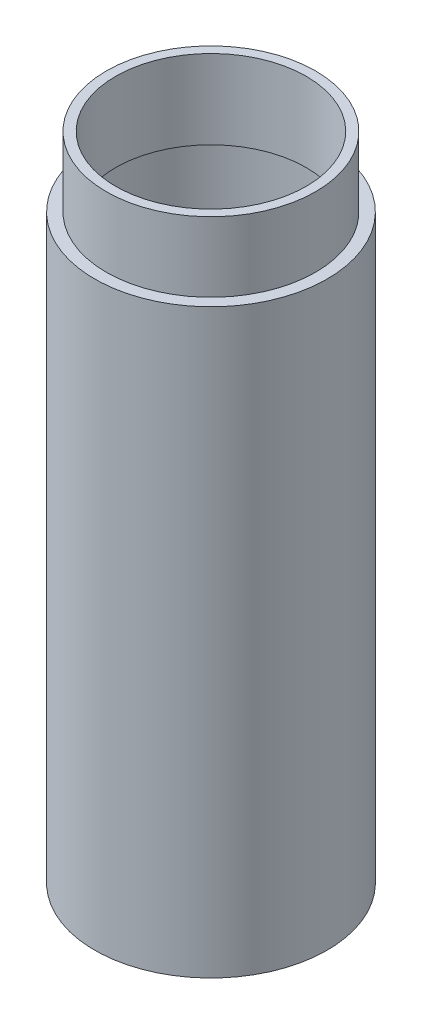
ISO-10303-21;
HEADER;
FILE_DESCRIPTION(('STEP AP214'),'2;1');
FILE_NAME('part.step','',(''),(''),'','','');
FILE_SCHEMA(('AUTOMOTIVE_DESIGN { 1 0 10303 214 1 1 1 1 }'));
ENDSEC;
DATA;
#1=APPLICATION_CONTEXT('core data for automotive mechanical design processes');
#2=APPLICATION_PROTOCOL_DEFINITION('international standard','automotive_design',2000,#1);
#3=PRODUCT_CONTEXT('',#1,'mechanical');
#4=PRODUCT('Part','Part','',(#3));
#5=PRODUCT_RELATED_PRODUCT_CATEGORY('part','',(#4));
#6=PRODUCT_DEFINITION_FORMATION('','',#4);
#7=PRODUCT_DEFINITION_CONTEXT('part definition',#1,'design');
#8=PRODUCT_DEFINITION('design','',#6,#7);
#9=PRODUCT_DEFINITION_SHAPE('','',#8);
#10=(LENGTH_UNIT() NAMED_UNIT(*) SI_UNIT(.MILLI.,.METRE.));
#11=(NAMED_UNIT(*) PLANE_ANGLE_UNIT() SI_UNIT($,.RADIAN.));
#12=(NAMED_UNIT(*) SI_UNIT($,.STERADIAN.) SOLID_ANGLE_UNIT());
#13=UNCERTAINTY_MEASURE_WITH_UNIT(LENGTH_MEASURE(1.E-05),#10,'distance_accuracy_value','');
#14=(GEOMETRIC_REPRESENTATION_CONTEXT(3) GLOBAL_UNCERTAINTY_ASSIGNED_CONTEXT((#13)) GLOBAL_UNIT_ASSIGNED_CONTEXT((#10,
#11,#12)) REPRESENTATION_CONTEXT('',''));
#15=CARTESIAN_POINT('',(0.,0.,0.));
#16=DIRECTION('',(0.,0.,1.));
#17=DIRECTION('',(1.,0.,0.));
#18=AXIS2_PLACEMENT_3D('',#15,#16,#17);
#19=CARTESIAN_POINT('',(0.,158.75,0.));
#20=DIRECTION('',(0.,-1.,0.));
#21=DIRECTION('',(0.,0.,-1.));
#22=AXIS2_PLACEMENT_3D('',#19,#20,#21);
#23=CYLINDRICAL_SURFACE('',#22,31.75);
#24=CARTESIAN_POINT('',(0.,158.75,0.));
#25=DIRECTION('',(0.,1.,0.));
#26=DIRECTION('',(0.,0.,1.));
#27=AXIS2_PLACEMENT_3D('',#24,#25,#26);
#28=CIRCLE('',#27,31.75);
#29=CARTESIAN_POINT('',(0.,158.75,-31.75));
#30=VERTEX_POINT('',#29);
#31=EDGE_CURVE('E46',#30,#30,#28,.T.);
#32=CARTESIAN_POINT('',(0.,0.,0.));
#33=DIRECTION('',(0.,1.,0.));
#34=DIRECTION('',(0.,0.,1.));
#35=AXIS2_PLACEMENT_3D('',#32,#33,#34);
#36=CIRCLE('',#35,31.75);
#37=CARTESIAN_POINT('',(0.,0.,-31.75));
#38=VERTEX_POINT('',#37);
#39=EDGE_CURVE('E82',#38,#38,#36,.T.);
#40=CARTESIAN_POINT('',(0.,158.75,-31.75));
#41=CARTESIAN_POINT('',(0.,157.096354166667,-31.75));
#42=CARTESIAN_POINT('',(0.,155.442708333333,-31.75));
#43=CARTESIAN_POINT('',(0.,152.135416666667,-31.75));
#44=CARTESIAN_POINT('',(0.,150.481770833333,-31.75));
#45=CARTESIAN_POINT('',(0.,147.174479166667,-31.75));
#46=CARTESIAN_POINT('',(0.,145.520833333333,-31.75));
#47=CARTESIAN_POINT('',(0.,142.213541666667,-31.75));
#48=CARTESIAN_POINT('',(0.,140.559895833333,-31.75));
#49=CARTESIAN_POINT('',(0.,137.252604166667,-31.75));
#50=CARTESIAN_POINT('',(0.,135.598958333333,-31.75));
#51=CARTESIAN_POINT('',(0.,132.291666666667,-31.75));
#52=CARTESIAN_POINT('',(0.,130.638020833333,-31.75));
#53=CARTESIAN_POINT('',(0.,127.330729166667,-31.75));
#54=CARTESIAN_POINT('',(0.,125.677083333333,-31.75));
#55=CARTESIAN_POINT('',(0.,122.369791666667,-31.75));
#56=CARTESIAN_POINT('',(0.,120.716145833333,-31.75));
#57=CARTESIAN_POINT('',(0.,117.408854166667,-31.75));
#58=CARTESIAN_POINT('',(0.,115.755208333333,-31.75));
#59=CARTESIAN_POINT('',(0.,112.447916666667,-31.75));
#60=CARTESIAN_POINT('',(0.,110.794270833333,-31.75));
#61=CARTESIAN_POINT('',(0.,107.486979166667,-31.75));
#62=CARTESIAN_POINT('',(0.,105.833333333333,-31.75));
#63=CARTESIAN_POINT('',(0.,102.526041666667,-31.75));
#64=CARTESIAN_POINT('',(0.,100.872395833333,-31.75));
#65=CARTESIAN_POINT('',(0.,97.5651041666667,-31.75));
#66=CARTESIAN_POINT('',(0.,95.9114583333333,-31.75));
#67=CARTESIAN_POINT('',(0.,92.6041666666667,-31.75));
#68=CARTESIAN_POINT('',(0.,90.9505208333333,-31.75));
#69=CARTESIAN_POINT('',(0.,87.6432291666667,-31.75));
#70=CARTESIAN_POINT('',(0.,85.9895833333333,-31.75));
#71=CARTESIAN_POINT('',(0.,82.6822916666667,-31.75));
#72=CARTESIAN_POINT('',(0.,81.0286458333333,-31.75));
#73=CARTESIAN_POINT('',(0.,77.7213541666667,-31.75));
#74=CARTESIAN_POINT('',(0.,76.0677083333333,-31.75));
#75=CARTESIAN_POINT('',(0.,72.7604166666667,-31.75));
#76=CARTESIAN_POINT('',(0.,71.1067708333333,-31.75));
#77=CARTESIAN_POINT('',(0.,67.7994791666666,-31.75));
#78=CARTESIAN_POINT('',(0.,66.1458333333333,-31.75));
#79=CARTESIAN_POINT('',(0.,62.8385416666667,-31.75));
#80=CARTESIAN_POINT('',(0.,61.1848958333333,-31.75));
#81=CARTESIAN_POINT('',(0.,57.8776041666666,-31.75));
#82=CARTESIAN_POINT('',(0.,56.2239583333333,-31.75));
#83=CARTESIAN_POINT('',(0.,52.9166666666667,-31.75));
#84=CARTESIAN_POINT('',(0.,51.2630208333333,-31.75));
#85=CARTESIAN_POINT('',(0.,47.9557291666667,-31.75));
#86=CARTESIAN_POINT('',(0.,46.3020833333333,-31.75));
#87=CARTESIAN_POINT('',(0.,42.9947916666667,-31.75));
#88=CARTESIAN_POINT('',(0.,41.3411458333333,-31.75));
#89=CARTESIAN_POINT('',(0.,38.0338541666667,-31.75));
#90=CARTESIAN_POINT('',(0.,36.3802083333333,-31.75));
#91=CARTESIAN_POINT('',(0.,33.0729166666666,-31.75));
#92=CARTESIAN_POINT('',(0.,31.4192708333333,-31.75));
#93=CARTESIAN_POINT('',(0.,28.1119791666667,-31.75));
#94=CARTESIAN_POINT('',(0.,26.4583333333333,-31.75));
#95=CARTESIAN_POINT('',(0.,23.1510416666666,-31.75));
#96=CARTESIAN_POINT('',(0.,21.4973958333333,-31.75));
#97=CARTESIAN_POINT('',(0.,18.1901041666666,-31.75));
#98=CARTESIAN_POINT('',(0.,16.5364583333333,-31.75));
#99=CARTESIAN_POINT('',(0.,13.2291666666666,-31.75));
#100=CARTESIAN_POINT('',(0.,11.5755208333333,-31.75));
#101=CARTESIAN_POINT('',(0.,8.26822916666664,-31.75));
#102=CARTESIAN_POINT('',(0.,6.61458333333331,-31.75));
#103=CARTESIAN_POINT('',(0.,3.30729166666665,-31.75));
#104=CARTESIAN_POINT('',(0.,1.65364583333331,-31.75));
#105=CARTESIAN_POINT('',(0.,0.,-31.75));
#106=B_SPLINE_CURVE_WITH_KNOTS('',3,(#40,#41,#42,#43,#44,#45,#46,#47,#48,#49,#50,#51,#52,#53,
#54,#55,#56,#57,#58,#59,#60,#61,#62,#63,#64,#65,#66,#67,#68,#69,#70,#71,#72,#73,#74,#75,#76,#77,
#78,#79,#80,#81,#82,#83,#84,#85,#86,#87,#88,#89,#90,#91,#92,#93,#94,#95,#96,#97,#98,#99,#100,
#101,#102,#103,#104,#105),.UNSPECIFIED.,.F.,.F.,(4,2,2,2,2,2,2,2,2,2,2,2,2,2,2,2,2,2,2,2,2,2,2,
2,2,2,2,2,2,2,2,2,4),(0.,4.96093749999998,9.921875,14.8828125,19.84375,24.8046875,29.765625,
34.7265625,39.6875,44.6484375,49.609375,54.5703125,59.53125,64.4921875,69.453125,74.4140625,
79.375,84.3359375,89.296875,94.2578125,99.21875,104.1796875,109.140625,114.1015625,119.0625,
124.0234375,128.984375,133.9453125,138.90625,143.8671875,148.828125,153.7890625,158.75),.UNSPECIFIED.);
#107=EDGE_CURVE('BSEAM37',#30,#38,#106,.T.);
#108=ORIENTED_EDGE('',*,*,#31,.F.);
#109=ORIENTED_EDGE('',*,*,#39,.T.);
#110=ORIENTED_EDGE('',*,*,#107,.T.);
#111=ORIENTED_EDGE('',*,*,#107,.F.);
#112=EDGE_LOOP('',(#108,#110,#109,#111));
#113=FACE_BOUND('',#112,.T.);
#114=ADVANCED_FACE('F37',(#113),#23,.T.);
#115=CARTESIAN_POINT('',(0.,158.75,0.));
#116=DIRECTION('',(0.,1.,0.));
#117=DIRECTION('',(0.,0.,1.));
#118=AXIS2_PLACEMENT_3D('',#115,#116,#117);
#119=PLANE('',#118);
#120=CARTESIAN_POINT('',(0.,158.75,0.));
#121=DIRECTION('',(0.,1.,0.));
#122=DIRECTION('',(0.,0.,1.));
#123=AXIS2_PLACEMENT_3D('',#120,#121,#122);
#124=CIRCLE('',#123,28.575);
#125=CARTESIAN_POINT('',(0.,158.75,-28.575));
#126=VERTEX_POINT('',#125);
#127=EDGE_CURVE('E11',#126,#126,#124,.T.);
#128=ORIENTED_EDGE('',*,*,#127,.F.);
#129=EDGE_LOOP('',(#128));
#130=FACE_BOUND('',#129,.T.);
#131=ORIENTED_EDGE('',*,*,#31,.T.);
#132=EDGE_LOOP('',(#131));
#133=FACE_BOUND('',#132,.T.);
#134=ADVANCED_FACE('F92',(#130,#133),#119,.T.);
#135=CARTESIAN_POINT('',(0.,0.,0.));
#136=DIRECTION('',(0.,1.,0.));
#137=DIRECTION('',(0.,0.,1.));
#138=AXIS2_PLACEMENT_3D('',#135,#136,#137);
#139=PLANE('',#138);
#140=CARTESIAN_POINT('',(0.,0.,0.));
#141=DIRECTION('',(0.,-1.,0.));
#142=DIRECTION('',(0.,0.,-1.));
#143=AXIS2_PLACEMENT_3D('',#140,#141,#142);
#144=CIRCLE('',#143,25.4);
#145=CARTESIAN_POINT('',(0.,0.,-25.4));
#146=VERTEX_POINT('',#145);
#147=EDGE_CURVE('E76',#146,#146,#144,.T.);
#148=ORIENTED_EDGE('',*,*,#147,.F.);
#149=EDGE_LOOP('',(#148));
#150=FACE_BOUND('',#149,.T.);
#151=ORIENTED_EDGE('',*,*,#39,.F.);
#152=EDGE_LOOP('',(#151));
#153=FACE_BOUND('',#152,.T.);
#154=ADVANCED_FACE('F89',(#150,#153),#139,.F.);
#155=CARTESIAN_POINT('',(0.,177.8,0.));
#156=DIRECTION('',(0.,-1.,0.));
#157=DIRECTION('',(0.,0.,-1.));
#158=AXIS2_PLACEMENT_3D('',#155,#156,#157);
#159=CYLINDRICAL_SURFACE('',#158,28.575);
#160=CARTESIAN_POINT('',(0.,177.8,0.));
#161=DIRECTION('',(0.,1.,0.));
#162=DIRECTION('',(0.,0.,1.));
#163=AXIS2_PLACEMENT_3D('',#160,#161,#162);
#164=CIRCLE('',#163,28.575);
#165=CARTESIAN_POINT('',(0.,177.8,-28.575));
#166=VERTEX_POINT('',#165);
#167=EDGE_CURVE('E80',#166,#166,#164,.T.);
#168=CARTESIAN_POINT('',(0.,177.8,-28.575));
#169=CARTESIAN_POINT('',(0.,177.6015625,-28.575));
#170=CARTESIAN_POINT('',(0.,177.403125,-28.575));
#171=CARTESIAN_POINT('',(0.,177.00625,-28.575));
#172=CARTESIAN_POINT('',(0.,176.8078125,-28.575));
#173=CARTESIAN_POINT('',(0.,176.4109375,-28.575));
#174=CARTESIAN_POINT('',(0.,176.2125,-28.575));
#175=CARTESIAN_POINT('',(0.,175.815625,-28.575));
#176=CARTESIAN_POINT('',(0.,175.6171875,-28.575));
#177=CARTESIAN_POINT('',(0.,175.2203125,-28.575));
#178=CARTESIAN_POINT('',(0.,175.021875,-28.575));
#179=CARTESIAN_POINT('',(0.,174.625,-28.575));
#180=CARTESIAN_POINT('',(0.,174.4265625,-28.575));
#181=CARTESIAN_POINT('',(0.,174.0296875,-28.575));
#182=CARTESIAN_POINT('',(0.,173.83125,-28.575));
#183=CARTESIAN_POINT('',(0.,173.434375,-28.575));
#184=CARTESIAN_POINT('',(0.,173.2359375,-28.575));
#185=CARTESIAN_POINT('',(0.,172.8390625,-28.575));
#186=CARTESIAN_POINT('',(0.,172.640625,-28.575));
#187=CARTESIAN_POINT('',(0.,172.24375,-28.575));
#188=CARTESIAN_POINT('',(0.,172.0453125,-28.575));
#189=CARTESIAN_POINT('',(0.,171.6484375,-28.575));
#190=CARTESIAN_POINT('',(0.,171.45,-28.575));
#191=CARTESIAN_POINT('',(0.,171.053125,-28.575));
#192=CARTESIAN_POINT('',(0.,170.8546875,-28.575));
#193=CARTESIAN_POINT('',(0.,170.4578125,-28.575));
#194=CARTESIAN_POINT('',(0.,170.259375,-28.575));
#195=CARTESIAN_POINT('',(0.,169.8625,-28.575));
#196=CARTESIAN_POINT('',(0.,169.6640625,-28.575));
#197=CARTESIAN_POINT('',(0.,169.2671875,-28.575));
#198=CARTESIAN_POINT('',(0.,169.06875,-28.575));
#199=CARTESIAN_POINT('',(0.,168.671875,-28.575));
#200=CARTESIAN_POINT('',(0.,168.4734375,-28.575));
#201=CARTESIAN_POINT('',(0.,168.0765625,-28.575));
#202=CARTESIAN_POINT('',(0.,167.878125,-28.575));
#203=CARTESIAN_POINT('',(0.,167.48125,-28.575));
#204=CARTESIAN_POINT('',(0.,167.2828125,-28.575));
#205=CARTESIAN_POINT('',(0.,166.8859375,-28.575));
#206=CARTESIAN_POINT('',(0.,166.6875,-28.575));
#207=CARTESIAN_POINT('',(0.,166.290625,-28.575));
#208=CARTESIAN_POINT('',(0.,166.0921875,-28.575));
#209=CARTESIAN_POINT('',(0.,165.6953125,-28.575));
#210=CARTESIAN_POINT('',(0.,165.496875,-28.575));
#211=CARTESIAN_POINT('',(0.,165.1,-28.575));
#212=CARTESIAN_POINT('',(0.,164.9015625,-28.575));
#213=CARTESIAN_POINT('',(0.,164.5046875,-28.575));
#214=CARTESIAN_POINT('',(0.,164.30625,-28.575));
#215=CARTESIAN_POINT('',(0.,163.909375,-28.575));
#216=CARTESIAN_POINT('',(0.,163.7109375,-28.575));
#217=CARTESIAN_POINT('',(0.,163.3140625,-28.575));
#218=CARTESIAN_POINT('',(0.,163.115625,-28.575));
#219=CARTESIAN_POINT('',(0.,162.71875,-28.575));
#220=CARTESIAN_POINT('',(0.,162.5203125,-28.575));
#221=CARTESIAN_POINT('',(0.,162.1234375,-28.575));
#222=CARTESIAN_POINT('',(0.,161.925,-28.575));
#223=CARTESIAN_POINT('',(0.,161.528125,-28.575));
#224=CARTESIAN_POINT('',(0.,161.3296875,-28.575));
#225=CARTESIAN_POINT('',(0.,160.9328125,-28.575));
#226=CARTESIAN_POINT('',(0.,160.734375,-28.575));
#227=CARTESIAN_POINT('',(0.,160.3375,-28.575));
#228=CARTESIAN_POINT('',(0.,160.1390625,-28.575));
#229=CARTESIAN_POINT('',(0.,159.7421875,-28.575));
#230=CARTESIAN_POINT('',(0.,159.54375,-28.575));
#231=CARTESIAN_POINT('',(0.,159.146875,-28.575));
#232=CARTESIAN_POINT('',(0.,158.9484375,-28.575));
#233=CARTESIAN_POINT('',(0.,158.75,-28.575));
#234=B_SPLINE_CURVE_WITH_KNOTS('',3,(#168,#169,#170,#171,#172,#173,#174,#175,#176,#177,#178,
#179,#180,#181,#182,#183,#184,#185,#186,#187,#188,#189,#190,#191,#192,#193,#194,#195,#196,#197,
#198,#199,#200,#201,#202,#203,#204,#205,#206,#207,#208,#209,#210,#211,#212,#213,#214,#215,#216,
#217,#218,#219,#220,#221,#222,#223,#224,#225,#226,#227,#228,#229,#230,#231,#232,#233),
.UNSPECIFIED.,.F.,.F.,(4,2,2,2,2,2,2,2,2,2,2,2,2,2,2,2,2,2,2,2,2,2,2,2,2,2,2,2,2,2,2,2,4),(0.,
0.595312500000028,1.19062500000003,1.78593750000003,2.38125000000003,2.97656250000003,
3.57187500000003,4.16718750000003,4.76250000000003,5.35781250000003,5.95312500000003,
6.54843750000003,7.14375000000003,7.73906250000003,8.33437500000003,8.92968750000003,
9.52500000000003,10.1203125,10.715625,11.3109375,11.90625,12.5015625,13.096875,13.6921875,
14.2875,14.8828125,15.478125,16.0734375,16.66875,17.2640625,17.859375,18.4546875,19.05),.UNSPECIFIED.);
#235=EDGE_CURVE('BSEAM91',#166,#126,#234,.T.);
#236=ORIENTED_EDGE('',*,*,#167,.F.);
#237=ORIENTED_EDGE('',*,*,#127,.T.);
#238=ORIENTED_EDGE('',*,*,#235,.T.);
#239=ORIENTED_EDGE('',*,*,#235,.F.);
#240=EDGE_LOOP('',(#236,#238,#237,#239));
#241=FACE_BOUND('',#240,.T.);
#242=ADVANCED_FACE('F91',(#241),#159,.T.);
#243=CARTESIAN_POINT('',(0.,177.8,0.));
#244=DIRECTION('',(0.,1.,0.));
#245=DIRECTION('',(0.,0.,1.));
#246=AXIS2_PLACEMENT_3D('',#243,#244,#245);
#247=PLANE('',#246);
#248=CARTESIAN_POINT('',(0.,177.8,0.));
#249=DIRECTION('',(0.,1.,0.));
#250=DIRECTION('',(0.,0.,1.));
#251=AXIS2_PLACEMENT_3D('',#248,#249,#250);
#252=CIRCLE('',#251,26.035);
#253=CARTESIAN_POINT('',(0.,177.8,-26.035));
#254=VERTEX_POINT('',#253);
#255=EDGE_CURVE('E69',#254,#254,#252,.T.);
#256=ORIENTED_EDGE('',*,*,#255,.F.);
#257=EDGE_LOOP('',(#256));
#258=FACE_BOUND('',#257,.T.);
#259=ORIENTED_EDGE('',*,*,#167,.T.);
#260=EDGE_LOOP('',(#259));
#261=FACE_BOUND('',#260,.T.);
#262=ADVANCED_FACE('F99',(#258,#261),#247,.T.);
#263=CARTESIAN_POINT('',(0.,0.,0.));
#264=DIRECTION('',(0.,-1.,0.));
#265=DIRECTION('',(0.,0.,-1.));
#266=AXIS2_PLACEMENT_3D('',#263,#264,#265);
#267=CONICAL_SURFACE('',#266,25.4,0.78539816339745);
#268=CARTESIAN_POINT('',(0.,6.35,0.));
#269=DIRECTION('',(0.,-1.,0.));
#270=DIRECTION('',(0.,0.,-1.));
#271=AXIS2_PLACEMENT_3D('',#268,#269,#270);
#272=CIRCLE('',#271,19.05);
#273=CARTESIAN_POINT('',(0.,6.35,-19.05));
#274=VERTEX_POINT('',#273);
#275=EDGE_CURVE('E41',#274,#274,#272,.T.);
#276=ORIENTED_EDGE('',*,*,#275,.F.);
#277=EDGE_LOOP('',(#276));
#278=FACE_BOUND('',#277,.T.);
#279=ORIENTED_EDGE('',*,*,#147,.T.);
#280=EDGE_LOOP('',(#279));
#281=FACE_BOUND('',#280,.T.);
#282=ADVANCED_FACE('F111',(#278,#281),#267,.F.);
#283=CARTESIAN_POINT('',(0.,6.35,0.));
#284=DIRECTION('',(0.,-1.,0.));
#285=DIRECTION('',(0.,0.,-1.));
#286=AXIS2_PLACEMENT_3D('',#283,#284,#285);
#287=PLANE('',#286);
#288=CARTESIAN_POINT('',(0.,6.35,0.));
#289=DIRECTION('',(0.,-1.,0.));
#290=DIRECTION('',(0.,0.,-1.));
#291=AXIS2_PLACEMENT_3D('',#288,#289,#290);
#292=CIRCLE('',#291,6.35);
#293=CARTESIAN_POINT('',(0.,6.35,-6.35));
#294=VERTEX_POINT('',#293);
#295=EDGE_CURVE('E73',#294,#294,#292,.T.);
#296=ORIENTED_EDGE('',*,*,#295,.F.);
#297=EDGE_LOOP('',(#296));
#298=FACE_BOUND('',#297,.T.);
#299=ORIENTED_EDGE('',*,*,#275,.T.);
#300=EDGE_LOOP('',(#299));
#301=FACE_BOUND('',#300,.T.);
#302=ADVANCED_FACE('F113',(#298,#301),#287,.T.);
#303=CARTESIAN_POINT('',(0.,6.35,0.));
#304=DIRECTION('',(0.,-1.,0.));
#305=DIRECTION('',(0.,0.,-1.));
#306=AXIS2_PLACEMENT_3D('',#303,#304,#305);
#307=CONICAL_SURFACE('',#306,6.35,1.0471975511966);
#308=CARTESIAN_POINT('',(0.,10.0161742093541,0.));
#309=VERTEX_POINT('',#308);
#310=VERTEX_LOOP('',#309);
#311=FACE_BOUND('',#310,.T.);
#312=ORIENTED_EDGE('',*,*,#295,.T.);
#313=EDGE_LOOP('',(#312));
#314=FACE_BOUND('',#313,.T.);
#315=ADVANCED_FACE('F39',(#311,#314),#307,.F.);
#316=CARTESIAN_POINT('',(0.,158.75,0.));
#317=DIRECTION('',(0.,-1.,0.));
#318=DIRECTION('',(0.,0.,-1.));
#319=AXIS2_PLACEMENT_3D('',#316,#317,#318);
#320=CYLINDRICAL_SURFACE('',#319,29.21);
#321=CARTESIAN_POINT('',(0.,156.21,0.));
#322=DIRECTION('',(0.,1.,0.));
#323=DIRECTION('',(0.,0.,1.));
#324=AXIS2_PLACEMENT_3D('',#321,#322,#323);
#325=CIRCLE('',#324,29.21);
#326=CARTESIAN_POINT('',(0.,156.21,-29.21));
#327=VERTEX_POINT('',#326);
#328=EDGE_CURVE('E159',#327,#327,#325,.T.);
#329=CARTESIAN_POINT('',(0.,5.08,0.));
#330=DIRECTION('',(0.,1.,0.));
#331=DIRECTION('',(0.,0.,1.));
#332=AXIS2_PLACEMENT_3D('',#329,#330,#331);
#333=CIRCLE('',#332,29.21);
#334=CARTESIAN_POINT('',(0.,5.08,-29.21));
#335=VERTEX_POINT('',#334);
#336=EDGE_CURVE('E72',#335,#335,#333,.T.);
#337=CARTESIAN_POINT('',(0.,156.21,-29.21));
#338=CARTESIAN_POINT('',(0.,154.635729166667,-29.21));
#339=CARTESIAN_POINT('',(0.,153.061458333333,-29.21));
#340=CARTESIAN_POINT('',(0.,149.912916666667,-29.21));
#341=CARTESIAN_POINT('',(0.,148.338645833333,-29.21));
#342=CARTESIAN_POINT('',(0.,145.190104166667,-29.21));
#343=CARTESIAN_POINT('',(0.,143.615833333333,-29.21));
#344=CARTESIAN_POINT('',(0.,140.467291666667,-29.21));
#345=CARTESIAN_POINT('',(0.,138.893020833333,-29.21));
#346=CARTESIAN_POINT('',(0.,135.744479166667,-29.21));
#347=CARTESIAN_POINT('',(0.,134.170208333333,-29.21));
#348=CARTESIAN_POINT('',(0.,131.021666666667,-29.21));
#349=CARTESIAN_POINT('',(0.,129.447395833333,-29.21));
#350=CARTESIAN_POINT('',(0.,126.298854166667,-29.21));
#351=CARTESIAN_POINT('',(0.,124.724583333333,-29.21));
#352=CARTESIAN_POINT('',(0.,121.576041666667,-29.21));
#353=CARTESIAN_POINT('',(0.,120.001770833333,-29.21));
#354=CARTESIAN_POINT('',(0.,116.853229166667,-29.21));
#355=CARTESIAN_POINT('',(0.,115.278958333333,-29.21));
#356=CARTESIAN_POINT('',(0.,112.130416666667,-29.21));
#357=CARTESIAN_POINT('',(0.,110.556145833333,-29.21));
#358=CARTESIAN_POINT('',(0.,107.407604166667,-29.21));
#359=CARTESIAN_POINT('',(0.,105.833333333333,-29.21));
#360=CARTESIAN_POINT('',(0.,102.684791666667,-29.21));
#361=CARTESIAN_POINT('',(0.,101.110520833333,-29.21));
#362=CARTESIAN_POINT('',(0.,97.9619791666667,-29.21));
#363=CARTESIAN_POINT('',(0.,96.3877083333333,-29.21));
#364=CARTESIAN_POINT('',(0.,93.2391666666667,-29.21));
#365=CARTESIAN_POINT('',(0.,91.6648958333333,-29.21));
#366=CARTESIAN_POINT('',(0.,88.5163541666667,-29.21));
#367=CARTESIAN_POINT('',(0.,86.9420833333333,-29.21));
#368=CARTESIAN_POINT('',(0.,83.7935416666667,-29.21));
#369=CARTESIAN_POINT('',(0.,82.2192708333333,-29.21));
#370=CARTESIAN_POINT('',(0.,79.0707291666667,-29.21));
#371=CARTESIAN_POINT('',(0.,77.4964583333333,-29.21));
#372=CARTESIAN_POINT('',(0.,74.3479166666667,-29.21));
#373=CARTESIAN_POINT('',(0.,72.7736458333333,-29.21));
#374=CARTESIAN_POINT('',(0.,69.6251041666667,-29.21));
#375=CARTESIAN_POINT('',(0.,68.0508333333333,-29.21));
#376=CARTESIAN_POINT('',(0.,64.9022916666667,-29.21));
#377=CARTESIAN_POINT('',(0.,63.3280208333333,-29.21));
#378=CARTESIAN_POINT('',(0.,60.1794791666667,-29.21));
#379=CARTESIAN_POINT('',(0.,58.6052083333333,-29.21));
#380=CARTESIAN_POINT('',(0.,55.4566666666667,-29.21));
#381=CARTESIAN_POINT('',(0.,53.8823958333333,-29.21));
#382=CARTESIAN_POINT('',(0.,50.7338541666667,-29.21));
#383=CARTESIAN_POINT('',(0.,49.1595833333333,-29.21));
#384=CARTESIAN_POINT('',(0.,46.0110416666667,-29.21));
#385=CARTESIAN_POINT('',(0.,44.4367708333333,-29.21));
#386=CARTESIAN_POINT('',(0.,41.2882291666667,-29.21));
#387=CARTESIAN_POINT('',(0.,39.7139583333333,-29.21));
#388=CARTESIAN_POINT('',(0.,36.5654166666667,-29.21));
#389=CARTESIAN_POINT('',(0.,34.9911458333333,-29.21));
#390=CARTESIAN_POINT('',(0.,31.8426041666667,-29.21));
#391=CARTESIAN_POINT('',(0.,30.2683333333333,-29.21));
#392=CARTESIAN_POINT('',(0.,27.1197916666667,-29.21));
#393=CARTESIAN_POINT('',(0.,25.5455208333333,-29.21));
#394=CARTESIAN_POINT('',(0.,22.3969791666667,-29.21));
#395=CARTESIAN_POINT('',(0.,20.8227083333333,-29.21));
#396=CARTESIAN_POINT('',(0.,17.6741666666667,-29.21));
#397=CARTESIAN_POINT('',(0.,16.0998958333333,-29.21));
#398=CARTESIAN_POINT('',(0.,12.9513541666667,-29.21));
#399=CARTESIAN_POINT('',(0.,11.3770833333333,-29.21));
#400=CARTESIAN_POINT('',(0.,8.22854166666667,-29.21));
#401=CARTESIAN_POINT('',(0.,6.65427083333334,-29.21));
#402=CARTESIAN_POINT('',(0.,5.08,-29.21));
#403=B_SPLINE_CURVE_WITH_KNOTS('',3,(#337,#338,#339,#340,#341,#342,#343,#344,#345,#346,#347,
#348,#349,#350,#351,#352,#353,#354,#355,#356,#357,#358,#359,#360,#361,#362,#363,#364,#365,#366,
#367,#368,#369,#370,#371,#372,#373,#374,#375,#376,#377,#378,#379,#380,#381,#382,#383,#384,#385,
#386,#387,#388,#389,#390,#391,#392,#393,#394,#395,#396,#397,#398,#399,#400,#401,#402),
.UNSPECIFIED.,.F.,.F.,(4,2,2,2,2,2,2,2,2,2,2,2,2,2,2,2,2,2,2,2,2,2,2,2,2,2,2,2,2,2,2,2,4),(0.,
4.72281249999998,9.44562499999999,14.1684375,18.89125,23.6140625,28.336875,33.0596875,37.7825,
42.5053125,47.228125,51.9509375,56.67375,61.3965625,66.119375,70.8421875,75.565,80.2878125,
85.010625,89.7334375,94.45625,99.1790625,103.901875,108.6246875,113.3475,118.0703125,122.793125,
127.5159375,132.23875,136.9615625,141.684375,146.4071875,151.13),.UNSPECIFIED.);
#404=EDGE_CURVE('BSEAM149',#327,#335,#403,.T.);
#405=ORIENTED_EDGE('',*,*,#328,.T.);
#406=ORIENTED_EDGE('',*,*,#336,.F.);
#407=ORIENTED_EDGE('',*,*,#404,.T.);
#408=ORIENTED_EDGE('',*,*,#404,.F.);
#409=EDGE_LOOP('',(#405,#407,#406,#408));
#410=FACE_BOUND('',#409,.T.);
#411=ADVANCED_FACE('F149',(#410),#320,.F.);
#412=CARTESIAN_POINT('',(0.,156.21,0.));
#413=DIRECTION('',(0.,1.,0.));
#414=DIRECTION('',(0.,0.,1.));
#415=AXIS2_PLACEMENT_3D('',#412,#413,#414);
#416=PLANE('',#415);
#417=CARTESIAN_POINT('',(0.,156.21,0.));
#418=DIRECTION('',(0.,1.,0.));
#419=DIRECTION('',(0.,0.,1.));
#420=AXIS2_PLACEMENT_3D('',#417,#418,#419);
#421=CIRCLE('',#420,26.035);
#422=CARTESIAN_POINT('',(0.,156.21,-26.035));
#423=VERTEX_POINT('',#422);
#424=EDGE_CURVE('E77',#423,#423,#421,.T.);
#425=ORIENTED_EDGE('',*,*,#424,.T.);
#426=EDGE_LOOP('',(#425));
#427=FACE_BOUND('',#426,.T.);
#428=ORIENTED_EDGE('',*,*,#328,.F.);
#429=EDGE_LOOP('',(#428));
#430=FACE_BOUND('',#429,.T.);
#431=ADVANCED_FACE('F145',(#427,#430),#416,.F.);
#432=CARTESIAN_POINT('',(0.,5.08,0.));
#433=DIRECTION('',(0.,1.,0.));
#434=DIRECTION('',(0.,0.,1.));
#435=AXIS2_PLACEMENT_3D('',#432,#433,#434);
#436=PLANE('',#435);
#437=CARTESIAN_POINT('',(0.,5.08,0.));
#438=DIRECTION('',(0.,1.,0.));
#439=DIRECTION('',(0.,0.,1.));
#440=AXIS2_PLACEMENT_3D('',#437,#438,#439);
#441=CIRCLE('',#440,27.5042048968553);
#442=CARTESIAN_POINT('',(0.,5.08,27.5042048968553));
#443=VERTEX_POINT('',#442);
#444=EDGE_CURVE('E62',#443,#443,#441,.F.);
#445=ORIENTED_EDGE('',*,*,#444,.T.);
#446=EDGE_LOOP('',(#445));
#447=FACE_BOUND('',#446,.T.);
#448=ORIENTED_EDGE('',*,*,#336,.T.);
#449=EDGE_LOOP('',(#448));
#450=FACE_BOUND('',#449,.T.);
#451=ADVANCED_FACE('F141',(#447,#450),#436,.T.);
#452=CARTESIAN_POINT('',(0.,177.8,0.));
#453=DIRECTION('',(0.,-1.,0.));
#454=DIRECTION('',(0.,0.,-1.));
#455=AXIS2_PLACEMENT_3D('',#452,#453,#454);
#456=CYLINDRICAL_SURFACE('',#455,26.035);
#457=CARTESIAN_POINT('',(0.,177.8,-26.035));
#458=CARTESIAN_POINT('',(0.,177.575104166667,-26.035));
#459=CARTESIAN_POINT('',(0.,177.350208333333,-26.035));
#460=CARTESIAN_POINT('',(0.,176.900416666667,-26.035));
#461=CARTESIAN_POINT('',(0.,176.675520833333,-26.035));
#462=CARTESIAN_POINT('',(0.,176.225729166667,-26.035));
#463=CARTESIAN_POINT('',(0.,176.000833333333,-26.035));
#464=CARTESIAN_POINT('',(0.,175.551041666667,-26.035));
#465=CARTESIAN_POINT('',(0.,175.326145833333,-26.035));
#466=CARTESIAN_POINT('',(0.,174.876354166667,-26.035));
#467=CARTESIAN_POINT('',(0.,174.651458333333,-26.035));
#468=CARTESIAN_POINT('',(0.,174.201666666667,-26.035));
#469=CARTESIAN_POINT('',(0.,173.976770833333,-26.035));
#470=CARTESIAN_POINT('',(0.,173.526979166667,-26.035));
#471=CARTESIAN_POINT('',(0.,173.302083333333,-26.035));
#472=CARTESIAN_POINT('',(0.,172.852291666667,-26.035));
#473=CARTESIAN_POINT('',(0.,172.627395833333,-26.035));
#474=CARTESIAN_POINT('',(0.,172.177604166667,-26.035));
#475=CARTESIAN_POINT('',(0.,171.952708333333,-26.035));
#476=CARTESIAN_POINT('',(0.,171.502916666667,-26.035));
#477=CARTESIAN_POINT('',(0.,171.278020833333,-26.035));
#478=CARTESIAN_POINT('',(0.,170.828229166667,-26.035));
#479=CARTESIAN_POINT('',(0.,170.603333333333,-26.035));
#480=CARTESIAN_POINT('',(0.,170.153541666667,-26.035));
#481=CARTESIAN_POINT('',(0.,169.928645833333,-26.035));
#482=CARTESIAN_POINT('',(0.,169.478854166667,-26.035));
#483=CARTESIAN_POINT('',(0.,169.253958333333,-26.035));
#484=CARTESIAN_POINT('',(0.,168.804166666667,-26.035));
#485=CARTESIAN_POINT('',(0.,168.579270833333,-26.035));
#486=CARTESIAN_POINT('',(0.,168.129479166667,-26.035));
#487=CARTESIAN_POINT('',(0.,167.904583333333,-26.035));
#488=CARTESIAN_POINT('',(0.,167.454791666667,-26.035));
#489=CARTESIAN_POINT('',(0.,167.229895833333,-26.035));
#490=CARTESIAN_POINT('',(0.,166.780104166667,-26.035));
#491=CARTESIAN_POINT('',(0.,166.555208333333,-26.035));
#492=CARTESIAN_POINT('',(0.,166.105416666667,-26.035));
#493=CARTESIAN_POINT('',(0.,165.880520833333,-26.035));
#494=CARTESIAN_POINT('',(0.,165.430729166667,-26.035));
#495=CARTESIAN_POINT('',(0.,165.205833333333,-26.035));
#496=CARTESIAN_POINT('',(0.,164.756041666667,-26.035));
#497=CARTESIAN_POINT('',(0.,164.531145833333,-26.035));
#498=CARTESIAN_POINT('',(0.,164.081354166667,-26.035));
#499=CARTESIAN_POINT('',(0.,163.856458333333,-26.035));
#500=CARTESIAN_POINT('',(0.,163.406666666667,-26.035));
#501=CARTESIAN_POINT('',(0.,163.181770833333,-26.035));
#502=CARTESIAN_POINT('',(0.,162.731979166667,-26.035));
#503=CARTESIAN_POINT('',(0.,162.507083333333,-26.035));
#504=CARTESIAN_POINT('',(0.,162.057291666667,-26.035));
#505=CARTESIAN_POINT('',(0.,161.832395833333,-26.035));
#506=CARTESIAN_POINT('',(0.,161.382604166667,-26.035));
#507=CARTESIAN_POINT('',(0.,161.157708333333,-26.035));
#508=CARTESIAN_POINT('',(0.,160.707916666667,-26.035));
#509=CARTESIAN_POINT('',(0.,160.483020833333,-26.035));
#510=CARTESIAN_POINT('',(0.,160.033229166667,-26.035));
#511=CARTESIAN_POINT('',(0.,159.808333333333,-26.035));
#512=CARTESIAN_POINT('',(0.,159.358541666667,-26.035));
#513=CARTESIAN_POINT('',(0.,159.133645833333,-26.035));
#514=CARTESIAN_POINT('',(0.,158.683854166667,-26.035));
#515=CARTESIAN_POINT('',(0.,158.458958333333,-26.035));
#516=CARTESIAN_POINT('',(0.,158.009166666667,-26.035));
#517=CARTESIAN_POINT('',(0.,157.784270833333,-26.035));
#518=CARTESIAN_POINT('',(0.,157.334479166667,-26.035));
#519=CARTESIAN_POINT('',(0.,157.109583333333,-26.035));
#520=CARTESIAN_POINT('',(0.,156.659791666667,-26.035));
#521=CARTESIAN_POINT('',(0.,156.434895833333,-26.035));
#522=CARTESIAN_POINT('',(0.,156.21,-26.035));
#523=B_SPLINE_CURVE_WITH_KNOTS('',3,(#457,#458,#459,#460,#461,#462,#463,#464,#465,#466,#467,
#468,#469,#470,#471,#472,#473,#474,#475,#476,#477,#478,#479,#480,#481,#482,#483,#484,#485,#486,
#487,#488,#489,#490,#491,#492,#493,#494,#495,#496,#497,#498,#499,#500,#501,#502,#503,#504,#505,
#506,#507,#508,#509,#510,#511,#512,#513,#514,#515,#516,#517,#518,#519,#520,#521,#522),
.UNSPECIFIED.,.F.,.F.,(4,2,2,2,2,2,2,2,2,2,2,2,2,2,2,2,2,2,2,2,2,2,2,2,2,2,2,2,2,2,2,2,4),(0.,
0.674687500000021,1.34937500000001,2.02406250000001,2.69875000000003,3.37343750000002,
4.04812500000001,4.72281250000001,5.39750000000003,6.07218750000002,6.74687500000001,
7.42156250000001,8.09625000000003,8.77093750000002,9.44562500000001,10.1203125,10.795,
11.4696875,12.144375,12.8190625,13.49375,14.1684375,14.843125,15.5178125,16.1925,16.8671875,
17.541875,18.2165625,18.89125,19.5659375,20.240625,20.9153125,21.59),.UNSPECIFIED.);
#524=EDGE_CURVE('BSEAM137',#254,#423,#523,.T.);
#525=ORIENTED_EDGE('',*,*,#255,.T.);
#526=ORIENTED_EDGE('',*,*,#424,.F.);
#527=ORIENTED_EDGE('',*,*,#524,.T.);
#528=ORIENTED_EDGE('',*,*,#524,.F.);
#529=EDGE_LOOP('',(#525,#527,#526,#528));
#530=FACE_BOUND('',#529,.T.);
#531=ADVANCED_FACE('F137',(#530),#456,.F.);
#532=CARTESIAN_POINT('',(0.,3.59210244842767,0.));
#533=DIRECTION('',(0.,-1.,0.));
#534=DIRECTION('',(0.,0.,-1.));
#535=AXIS2_PLACEMENT_3D('',#532,#533,#534);
#536=CONICAL_SURFACE('',#535,28.9921024484277,0.78539816339745);
#537=CARTESIAN_POINT('',(0.,11.43,0.));
#538=DIRECTION('',(0.,-1.,0.));
#539=DIRECTION('',(0.,0.,-1.));
#540=AXIS2_PLACEMENT_3D('',#537,#538,#539);
#541=CIRCLE('',#540,21.1542048968553);
#542=CARTESIAN_POINT('',(0.,11.43,-21.1542048968553));
#543=VERTEX_POINT('',#542);
#544=EDGE_CURVE('E65',#543,#543,#541,.T.);
#545=ORIENTED_EDGE('',*,*,#544,.T.);
#546=EDGE_LOOP('',(#545));
#547=FACE_BOUND('',#546,.T.);
#548=ORIENTED_EDGE('',*,*,#444,.F.);
#549=EDGE_LOOP('',(#548));
#550=FACE_BOUND('',#549,.T.);
#551=ADVANCED_FACE('F134',(#547,#550),#536,.T.);
#552=CARTESIAN_POINT('',(0.,11.43,0.));
#553=DIRECTION('',(0.,-1.,0.));
#554=DIRECTION('',(0.,0.,-1.));
#555=AXIS2_PLACEMENT_3D('',#552,#553,#554);
#556=PLANE('',#555);
#557=CARTESIAN_POINT('',(0.,11.43,0.));
#558=DIRECTION('',(0.,-1.,0.));
#559=DIRECTION('',(0.,0.,-1.));
#560=AXIS2_PLACEMENT_3D('',#557,#558,#559);
#561=CIRCLE('',#560,7.7111818975501);
#562=CARTESIAN_POINT('',(0.,11.43,-7.7111818975501));
#563=VERTEX_POINT('',#562);
#564=EDGE_CURVE('E60',#563,#563,#561,.T.);
#565=ORIENTED_EDGE('',*,*,#564,.T.);
#566=EDGE_LOOP('',(#565));
#567=FACE_BOUND('',#566,.T.);
#568=ORIENTED_EDGE('',*,*,#544,.F.);
#569=EDGE_LOOP('',(#568));
#570=FACE_BOUND('',#569,.T.);
#571=ADVANCED_FACE('F56',(#567,#570),#556,.F.);
#572=CARTESIAN_POINT('',(0.,10.749409051225,0.));
#573=DIRECTION('',(0.,-1.,0.));
#574=DIRECTION('',(0.,0.,-1.));
#575=AXIS2_PLACEMENT_3D('',#572,#573,#574);
#576=CONICAL_SURFACE('',#575,8.88999999999999,1.0471975511966);
#577=CARTESIAN_POINT('',(0.,15.8820529443207,0.));
#578=VERTEX_POINT('',#577);
#579=VERTEX_LOOP('',#578);
#580=FACE_BOUND('',#579,.T.);
#581=ORIENTED_EDGE('',*,*,#564,.F.);
#582=EDGE_LOOP('',(#581));
#583=FACE_BOUND('',#582,.T.);
#584=ADVANCED_FACE('F53',(#580,#583),#576,.T.);
#585=CLOSED_SHELL('',(#114,#134,#154,#242,#262,#282,#302,#315,#411,#431,#451,#531,#551,#571,#584));
#586=MANIFOLD_SOLID_BREP('B2',#585);
#587=ADVANCED_BREP_SHAPE_REPRESENTATION('',(#18,#586),#14);
#588=SHAPE_DEFINITION_REPRESENTATION(#9,#587);
ENDSEC;
END-ISO-10303-21;
